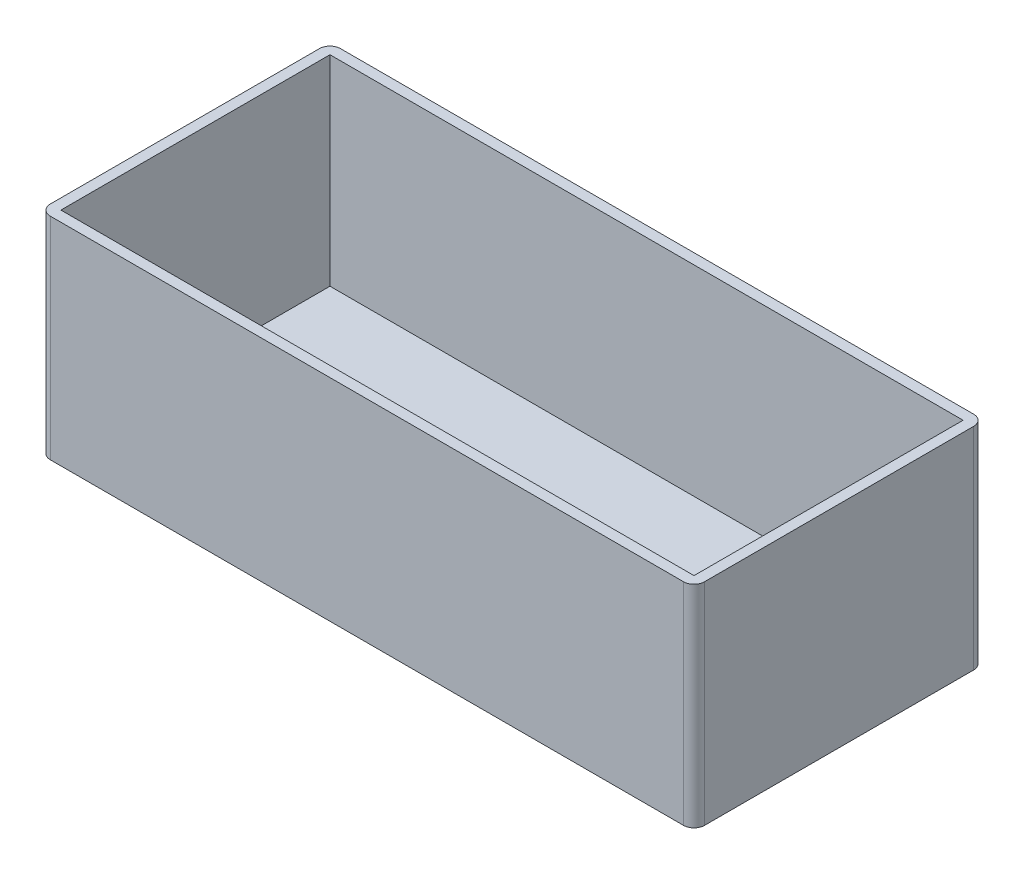
ISO-10303-21;
HEADER;
FILE_DESCRIPTION(('STEP AP214'),'2;1');
FILE_NAME('part.step','',(''),(''),'','','');
FILE_SCHEMA(('AUTOMOTIVE_DESIGN { 1 0 10303 214 1 1 1 1 }'));
ENDSEC;
DATA;
#1=APPLICATION_CONTEXT('core data for automotive mechanical design processes');
#2=APPLICATION_PROTOCOL_DEFINITION('international standard','automotive_design',2000,#1);
#3=PRODUCT_CONTEXT('',#1,'mechanical');
#4=PRODUCT('Part','Part','',(#3));
#5=PRODUCT_RELATED_PRODUCT_CATEGORY('part','',(#4));
#6=PRODUCT_DEFINITION_FORMATION('','',#4);
#7=PRODUCT_DEFINITION_CONTEXT('part definition',#1,'design');
#8=PRODUCT_DEFINITION('design','',#6,#7);
#9=PRODUCT_DEFINITION_SHAPE('','',#8);
#10=(LENGTH_UNIT() NAMED_UNIT(*) SI_UNIT(.MILLI.,.METRE.));
#11=(NAMED_UNIT(*) PLANE_ANGLE_UNIT() SI_UNIT($,.RADIAN.));
#12=(NAMED_UNIT(*) SI_UNIT($,.STERADIAN.) SOLID_ANGLE_UNIT());
#13=UNCERTAINTY_MEASURE_WITH_UNIT(LENGTH_MEASURE(1.E-05),#10,'distance_accuracy_value','');
#14=(GEOMETRIC_REPRESENTATION_CONTEXT(3) GLOBAL_UNCERTAINTY_ASSIGNED_CONTEXT((#13)) GLOBAL_UNIT_ASSIGNED_CONTEXT((#10,
#11,#12)) REPRESENTATION_CONTEXT('',''));
#15=CARTESIAN_POINT('',(0.,0.,0.));
#16=DIRECTION('',(0.,0.,1.));
#17=DIRECTION('',(1.,0.,0.));
#18=AXIS2_PLACEMENT_3D('',#15,#16,#17);
#19=CARTESIAN_POINT('',(2.,40.,-53.));
#20=DIRECTION('',(0.,1.,0.));
#21=DIRECTION('',(0.,0.,1.));
#22=AXIS2_PLACEMENT_3D('',#19,#20,#21);
#23=PLANE('',#22);
#24=CARTESIAN_POINT('',(2.,40.,-53.));
#25=DIRECTION('',(0.,1.,0.));
#26=DIRECTION('',(0.,0.,1.));
#27=AXIS2_PLACEMENT_3D('',#24,#25,#26);
#28=CIRCLE('',#27,2.);
#29=CARTESIAN_POINT('',(2.00000000000001,40.,-55.));
#30=VERTEX_POINT('',#29);
#31=CARTESIAN_POINT('',(0.,40.,-53.));
#32=VERTEX_POINT('',#31);
#33=EDGE_CURVE('E94',#30,#32,#28,.T.);
#34=ORIENTED_EDGE('',*,*,#33,.T.);
#35=DIRECTION('',(0.,0.,-1.));
#36=VECTOR('',#35,1.);
#37=CARTESIAN_POINT('',(0.,40.,-2.00000000000001));
#38=LINE('',#37,#36);
#39=CARTESIAN_POINT('',(0.,40.,-2.00000000000001));
#40=VERTEX_POINT('',#39);
#41=EDGE_CURVE('E180',#40,#32,#38,.T.);
#42=ORIENTED_EDGE('',*,*,#41,.F.);
#43=CARTESIAN_POINT('',(2.,40.,-2.));
#44=DIRECTION('',(0.,1.,0.));
#45=DIRECTION('',(0.,0.,1.));
#46=AXIS2_PLACEMENT_3D('',#43,#44,#45);
#47=CIRCLE('',#46,2.);
#48=CARTESIAN_POINT('',(2.00000000000001,40.,0.));
#49=VERTEX_POINT('',#48);
#50=EDGE_CURVE('E171',#40,#49,#47,.T.);
#51=ORIENTED_EDGE('',*,*,#50,.T.);
#52=DIRECTION('',(1.,0.,0.));
#53=VECTOR('',#52,1.);
#54=CARTESIAN_POINT('',(2.00000000000001,40.,0.));
#55=LINE('',#54,#53);
#56=CARTESIAN_POINT('',(122.,40.,0.));
#57=VERTEX_POINT('',#56);
#58=EDGE_CURVE('E188',#49,#57,#55,.T.);
#59=ORIENTED_EDGE('',*,*,#58,.T.);
#60=CARTESIAN_POINT('',(122.,40.,-2.));
#61=DIRECTION('',(0.,1.,0.));
#62=DIRECTION('',(0.,0.,1.));
#63=AXIS2_PLACEMENT_3D('',#60,#61,#62);
#64=CIRCLE('',#63,2.);
#65=CARTESIAN_POINT('',(124.,40.,-2.00000000000001));
#66=VERTEX_POINT('',#65);
#67=EDGE_CURVE('E118',#57,#66,#64,.T.);
#68=ORIENTED_EDGE('',*,*,#67,.T.);
#69=DIRECTION('',(0.,0.,-1.));
#70=VECTOR('',#69,1.);
#71=CARTESIAN_POINT('',(124.,40.,-2.00000000000001));
#72=LINE('',#71,#70);
#73=CARTESIAN_POINT('',(124.,40.,-53.));
#74=VERTEX_POINT('',#73);
#75=EDGE_CURVE('E112',#66,#74,#72,.T.);
#76=ORIENTED_EDGE('',*,*,#75,.T.);
#77=CARTESIAN_POINT('',(122.,40.,-53.));
#78=DIRECTION('',(0.,-1.,0.));
#79=DIRECTION('',(0.,0.,-1.));
#80=AXIS2_PLACEMENT_3D('',#77,#78,#79);
#81=CIRCLE('',#80,2.);
#82=CARTESIAN_POINT('',(122.,40.,-55.));
#83=VERTEX_POINT('',#82);
#84=EDGE_CURVE('E116',#83,#74,#81,.T.);
#85=ORIENTED_EDGE('',*,*,#84,.F.);
#86=DIRECTION('',(1.,0.,0.));
#87=VECTOR('',#86,1.);
#88=CARTESIAN_POINT('',(2.00000000000001,40.,-55.));
#89=LINE('',#88,#87);
#90=EDGE_CURVE('E135',#30,#83,#89,.T.);
#91=ORIENTED_EDGE('',*,*,#90,.F.);
#92=EDGE_LOOP('',(#34,#42,#51,#59,#68,#76,#85,#91));
#93=FACE_BOUND('',#92,.T.);
#94=DIRECTION('',(0.,0.,-1.));
#95=VECTOR('',#94,1.);
#96=CARTESIAN_POINT('',(2.,40.,-2.00000000000001));
#97=LINE('',#96,#95);
#98=CARTESIAN_POINT('',(2.,40.,-2.));
#99=VERTEX_POINT('',#98);
#100=CARTESIAN_POINT('',(2.,40.,-53.));
#101=VERTEX_POINT('',#100);
#102=EDGE_CURVE('E202',#99,#101,#97,.T.);
#103=ORIENTED_EDGE('',*,*,#102,.T.);
#104=DIRECTION('',(1.,0.,0.));
#105=VECTOR('',#104,1.);
#106=CARTESIAN_POINT('',(2.00000000000001,40.,-53.));
#107=LINE('',#106,#105);
#108=CARTESIAN_POINT('',(122.,40.,-53.));
#109=VERTEX_POINT('',#108);
#110=EDGE_CURVE('E194',#101,#109,#107,.T.);
#111=ORIENTED_EDGE('',*,*,#110,.T.);
#112=DIRECTION('',(0.,0.,-1.));
#113=VECTOR('',#112,1.);
#114=CARTESIAN_POINT('',(122.,40.,-2.00000000000001));
#115=LINE('',#114,#113);
#116=CARTESIAN_POINT('',(122.,40.,-2.));
#117=VERTEX_POINT('',#116);
#118=EDGE_CURVE('E198',#117,#109,#115,.T.);
#119=ORIENTED_EDGE('',*,*,#118,.F.);
#120=DIRECTION('',(1.,0.,0.));
#121=VECTOR('',#120,1.);
#122=CARTESIAN_POINT('',(2.00000000000001,40.,-2.));
#123=LINE('',#122,#121);
#124=EDGE_CURVE('E200',#99,#117,#123,.T.);
#125=ORIENTED_EDGE('',*,*,#124,.F.);
#126=EDGE_LOOP('',(#103,#111,#119,#125));
#127=FACE_BOUND('',#126,.T.);
#128=ADVANCED_FACE('F32',(#93,#127),#23,.T.);
#129=CARTESIAN_POINT('',(2.,40.,-53.));
#130=DIRECTION('',(0.,-1.,0.));
#131=DIRECTION('',(0.,0.,-1.));
#132=AXIS2_PLACEMENT_3D('',#129,#130,#131);
#133=CYLINDRICAL_SURFACE('',#132,2.);
#134=CARTESIAN_POINT('',(2.,0.,-53.));
#135=DIRECTION('',(0.,1.,0.));
#136=DIRECTION('',(0.,0.,1.));
#137=AXIS2_PLACEMENT_3D('',#134,#135,#136);
#138=CIRCLE('',#137,2.);
#139=CARTESIAN_POINT('',(2.00000000000001,0.,-55.));
#140=VERTEX_POINT('',#139);
#141=CARTESIAN_POINT('',(0.,0.,-53.));
#142=VERTEX_POINT('',#141);
#143=EDGE_CURVE('E140',#140,#142,#138,.T.);
#144=ORIENTED_EDGE('',*,*,#143,.T.);
#145=DIRECTION('',(0.,-1.,0.));
#146=VECTOR('',#145,1.);
#147=CARTESIAN_POINT('',(0.,40.,-53.));
#148=LINE('',#147,#146);
#149=EDGE_CURVE('E11',#32,#142,#148,.T.);
#150=ORIENTED_EDGE('',*,*,#149,.F.);
#151=ORIENTED_EDGE('',*,*,#33,.F.);
#152=DIRECTION('',(0.,-1.,0.));
#153=VECTOR('',#152,1.);
#154=CARTESIAN_POINT('',(2.00000000000001,40.,-55.));
#155=LINE('',#154,#153);
#156=EDGE_CURVE('E56',#30,#140,#155,.T.);
#157=ORIENTED_EDGE('',*,*,#156,.T.);
#158=EDGE_LOOP('',(#144,#150,#151,#157));
#159=FACE_BOUND('',#158,.T.);
#160=ADVANCED_FACE('F34',(#159),#133,.T.);
#161=CARTESIAN_POINT('',(0.,40.,-2.00000000000001));
#162=DIRECTION('',(-1.,0.,0.));
#163=DIRECTION('',(0.,0.,1.));
#164=AXIS2_PLACEMENT_3D('',#161,#162,#163);
#165=PLANE('',#164);
#166=DIRECTION('',(0.,0.,-1.));
#167=VECTOR('',#166,1.);
#168=CARTESIAN_POINT('',(0.,0.,-2.00000000000001));
#169=LINE('',#168,#167);
#170=CARTESIAN_POINT('',(0.,0.,-2.00000000000001));
#171=VERTEX_POINT('',#170);
#172=EDGE_CURVE('E142',#171,#142,#169,.T.);
#173=ORIENTED_EDGE('',*,*,#172,.F.);
#174=DIRECTION('',(0.,-1.,0.));
#175=VECTOR('',#174,1.);
#176=CARTESIAN_POINT('',(0.,40.,-2.00000000000001));
#177=LINE('',#176,#175);
#178=EDGE_CURVE('E40',#40,#171,#177,.T.);
#179=ORIENTED_EDGE('',*,*,#178,.F.);
#180=ORIENTED_EDGE('',*,*,#41,.T.);
#181=ORIENTED_EDGE('',*,*,#149,.T.);
#182=EDGE_LOOP('',(#173,#179,#180,#181));
#183=FACE_BOUND('',#182,.T.);
#184=ADVANCED_FACE('F179',(#183),#165,.T.);
#185=CARTESIAN_POINT('',(2.,40.,-2.));
#186=DIRECTION('',(0.,-1.,0.));
#187=DIRECTION('',(0.,0.,-1.));
#188=AXIS2_PLACEMENT_3D('',#185,#186,#187);
#189=CYLINDRICAL_SURFACE('',#188,2.);
#190=CARTESIAN_POINT('',(2.,0.,-2.));
#191=DIRECTION('',(0.,1.,0.));
#192=DIRECTION('',(0.,0.,1.));
#193=AXIS2_PLACEMENT_3D('',#190,#191,#192);
#194=CIRCLE('',#193,2.);
#195=CARTESIAN_POINT('',(2.00000000000001,0.,0.));
#196=VERTEX_POINT('',#195);
#197=EDGE_CURVE('E146',#171,#196,#194,.T.);
#198=ORIENTED_EDGE('',*,*,#197,.T.);
#199=DIRECTION('',(0.,-1.,0.));
#200=VECTOR('',#199,1.);
#201=CARTESIAN_POINT('',(2.00000000000001,40.,0.));
#202=LINE('',#201,#200);
#203=EDGE_CURVE('E164',#49,#196,#202,.T.);
#204=ORIENTED_EDGE('',*,*,#203,.F.);
#205=ORIENTED_EDGE('',*,*,#50,.F.);
#206=ORIENTED_EDGE('',*,*,#178,.T.);
#207=EDGE_LOOP('',(#198,#204,#205,#206));
#208=FACE_BOUND('',#207,.T.);
#209=ADVANCED_FACE('F169',(#208),#189,.T.);
#210=CARTESIAN_POINT('',(2.00000000000001,40.,0.));
#211=DIRECTION('',(0.,0.,-1.));
#212=DIRECTION('',(-1.,0.,0.));
#213=AXIS2_PLACEMENT_3D('',#210,#211,#212);
#214=PLANE('',#213);
#215=DIRECTION('',(1.,0.,0.));
#216=VECTOR('',#215,1.);
#217=CARTESIAN_POINT('',(2.00000000000001,0.,0.));
#218=LINE('',#217,#216);
#219=CARTESIAN_POINT('',(122.,0.,0.));
#220=VERTEX_POINT('',#219);
#221=EDGE_CURVE('E148',#196,#220,#218,.T.);
#222=ORIENTED_EDGE('',*,*,#221,.T.);
#223=DIRECTION('',(0.,-1.,0.));
#224=VECTOR('',#223,1.);
#225=CARTESIAN_POINT('',(122.,40.,0.));
#226=LINE('',#225,#224);
#227=EDGE_CURVE('E161',#57,#220,#226,.T.);
#228=ORIENTED_EDGE('',*,*,#227,.F.);
#229=ORIENTED_EDGE('',*,*,#58,.F.);
#230=ORIENTED_EDGE('',*,*,#203,.T.);
#231=EDGE_LOOP('',(#222,#228,#229,#230));
#232=FACE_BOUND('',#231,.T.);
#233=ADVANCED_FACE('F187',(#232),#214,.F.);
#234=CARTESIAN_POINT('',(122.,40.,-2.));
#235=DIRECTION('',(0.,-1.,0.));
#236=DIRECTION('',(0.,0.,-1.));
#237=AXIS2_PLACEMENT_3D('',#234,#235,#236);
#238=CYLINDRICAL_SURFACE('',#237,2.);
#239=CARTESIAN_POINT('',(122.,0.,-2.));
#240=DIRECTION('',(0.,1.,0.));
#241=DIRECTION('',(0.,0.,1.));
#242=AXIS2_PLACEMENT_3D('',#239,#240,#241);
#243=CIRCLE('',#242,2.);
#244=CARTESIAN_POINT('',(124.,0.,-2.00000000000001));
#245=VERTEX_POINT('',#244);
#246=EDGE_CURVE('E150',#220,#245,#243,.T.);
#247=ORIENTED_EDGE('',*,*,#246,.T.);
#248=DIRECTION('',(0.,-1.,0.));
#249=VECTOR('',#248,1.);
#250=CARTESIAN_POINT('',(124.,40.,-2.00000000000001));
#251=LINE('',#250,#249);
#252=EDGE_CURVE('E131',#66,#245,#251,.T.);
#253=ORIENTED_EDGE('',*,*,#252,.F.);
#254=ORIENTED_EDGE('',*,*,#67,.F.);
#255=ORIENTED_EDGE('',*,*,#227,.T.);
#256=EDGE_LOOP('',(#247,#253,#254,#255));
#257=FACE_BOUND('',#256,.T.);
#258=ADVANCED_FACE('F183',(#257),#238,.T.);
#259=CARTESIAN_POINT('',(124.,40.,-2.00000000000001));
#260=DIRECTION('',(-1.,0.,0.));
#261=DIRECTION('',(0.,0.,1.));
#262=AXIS2_PLACEMENT_3D('',#259,#260,#261);
#263=PLANE('',#262);
#264=DIRECTION('',(0.,0.,-1.));
#265=VECTOR('',#264,1.);
#266=CARTESIAN_POINT('',(124.,0.,-2.00000000000001));
#267=LINE('',#266,#265);
#268=CARTESIAN_POINT('',(124.,0.,-53.));
#269=VERTEX_POINT('',#268);
#270=EDGE_CURVE('E127',#245,#269,#267,.T.);
#271=ORIENTED_EDGE('',*,*,#270,.T.);
#272=DIRECTION('',(0.,-1.,0.));
#273=VECTOR('',#272,1.);
#274=CARTESIAN_POINT('',(124.,40.,-53.));
#275=LINE('',#274,#273);
#276=EDGE_CURVE('E124',#74,#269,#275,.T.);
#277=ORIENTED_EDGE('',*,*,#276,.F.);
#278=ORIENTED_EDGE('',*,*,#75,.F.);
#279=ORIENTED_EDGE('',*,*,#252,.T.);
#280=EDGE_LOOP('',(#271,#277,#278,#279));
#281=FACE_BOUND('',#280,.T.);
#282=ADVANCED_FACE('F125',(#281),#263,.F.);
#283=CARTESIAN_POINT('',(122.,40.,-53.));
#284=DIRECTION('',(0.,-1.,0.));
#285=DIRECTION('',(0.,0.,-1.));
#286=AXIS2_PLACEMENT_3D('',#283,#284,#285);
#287=CYLINDRICAL_SURFACE('',#286,2.);
#288=CARTESIAN_POINT('',(122.,0.,-53.));
#289=DIRECTION('',(0.,-1.,0.));
#290=DIRECTION('',(0.,0.,-1.));
#291=AXIS2_PLACEMENT_3D('',#288,#289,#290);
#292=CIRCLE('',#291,2.);
#293=CARTESIAN_POINT('',(122.,0.,-55.));
#294=VERTEX_POINT('',#293);
#295=EDGE_CURVE('E153',#294,#269,#292,.T.);
#296=ORIENTED_EDGE('',*,*,#295,.F.);
#297=DIRECTION('',(0.,-1.,0.));
#298=VECTOR('',#297,1.);
#299=CARTESIAN_POINT('',(122.,40.,-55.));
#300=LINE('',#299,#298);
#301=EDGE_CURVE('E132',#83,#294,#300,.T.);
#302=ORIENTED_EDGE('',*,*,#301,.F.);
#303=ORIENTED_EDGE('',*,*,#84,.T.);
#304=ORIENTED_EDGE('',*,*,#276,.T.);
#305=EDGE_LOOP('',(#296,#302,#303,#304));
#306=FACE_BOUND('',#305,.T.);
#307=ADVANCED_FACE('F134',(#306),#287,.T.);
#308=CARTESIAN_POINT('',(2.00000000000001,40.,-55.));
#309=DIRECTION('',(0.,0.,-1.));
#310=DIRECTION('',(-1.,0.,0.));
#311=AXIS2_PLACEMENT_3D('',#308,#309,#310);
#312=PLANE('',#311);
#313=DIRECTION('',(1.,0.,0.));
#314=VECTOR('',#313,1.);
#315=CARTESIAN_POINT('',(2.00000000000001,0.,-55.));
#316=LINE('',#315,#314);
#317=EDGE_CURVE('E155',#140,#294,#316,.T.);
#318=ORIENTED_EDGE('',*,*,#317,.F.);
#319=ORIENTED_EDGE('',*,*,#156,.F.);
#320=ORIENTED_EDGE('',*,*,#90,.T.);
#321=ORIENTED_EDGE('',*,*,#301,.T.);
#322=EDGE_LOOP('',(#318,#319,#320,#321));
#323=FACE_BOUND('',#322,.T.);
#324=ADVANCED_FACE('F181',(#323),#312,.T.);
#325=CARTESIAN_POINT('',(2.,0.,-53.));
#326=DIRECTION('',(0.,1.,0.));
#327=DIRECTION('',(0.,0.,1.));
#328=AXIS2_PLACEMENT_3D('',#325,#326,#327);
#329=PLANE('',#328);
#330=ORIENTED_EDGE('',*,*,#143,.F.);
#331=ORIENTED_EDGE('',*,*,#317,.T.);
#332=ORIENTED_EDGE('',*,*,#295,.T.);
#333=ORIENTED_EDGE('',*,*,#270,.F.);
#334=ORIENTED_EDGE('',*,*,#246,.F.);
#335=ORIENTED_EDGE('',*,*,#221,.F.);
#336=ORIENTED_EDGE('',*,*,#197,.F.);
#337=ORIENTED_EDGE('',*,*,#172,.T.);
#338=EDGE_LOOP('',(#330,#331,#332,#333,#334,#335,#336,#337));
#339=FACE_BOUND('',#338,.T.);
#340=ADVANCED_FACE('F177',(#339),#329,.F.);
#341=CARTESIAN_POINT('',(2.,40.,-2.00000000000001));
#342=DIRECTION('',(-1.,0.,0.));
#343=DIRECTION('',(0.,0.,1.));
#344=AXIS2_PLACEMENT_3D('',#341,#342,#343);
#345=PLANE('',#344);
#346=DIRECTION('',(0.,0.,-1.));
#347=VECTOR('',#346,1.);
#348=CARTESIAN_POINT('',(2.,2.,-2.00000000000001));
#349=LINE('',#348,#347);
#350=CARTESIAN_POINT('',(2.,2.,-2.));
#351=VERTEX_POINT('',#350);
#352=CARTESIAN_POINT('',(2.,2.,-53.));
#353=VERTEX_POINT('',#352);
#354=EDGE_CURVE('E218',#351,#353,#349,.T.);
#355=ORIENTED_EDGE('',*,*,#354,.T.);
#356=DIRECTION('',(0.,-1.,0.));
#357=VECTOR('',#356,1.);
#358=CARTESIAN_POINT('',(2.,40.,-53.));
#359=LINE('',#358,#357);
#360=EDGE_CURVE('E143',#101,#353,#359,.T.);
#361=ORIENTED_EDGE('',*,*,#360,.F.);
#362=ORIENTED_EDGE('',*,*,#102,.F.);
#363=DIRECTION('',(0.,-1.,0.));
#364=VECTOR('',#363,1.);
#365=CARTESIAN_POINT('',(2.,40.,-2.));
#366=LINE('',#365,#364);
#367=EDGE_CURVE('E215',#99,#351,#366,.T.);
#368=ORIENTED_EDGE('',*,*,#367,.T.);
#369=EDGE_LOOP('',(#355,#361,#362,#368));
#370=FACE_BOUND('',#369,.T.);
#371=ADVANCED_FACE('F228',(#370),#345,.F.);
#372=CARTESIAN_POINT('',(2.00000000000001,40.,-2.));
#373=DIRECTION('',(0.,0.,-1.));
#374=DIRECTION('',(-1.,0.,0.));
#375=AXIS2_PLACEMENT_3D('',#372,#373,#374);
#376=PLANE('',#375);
#377=DIRECTION('',(1.,0.,0.));
#378=VECTOR('',#377,1.);
#379=CARTESIAN_POINT('',(2.00000000000001,2.,-2.));
#380=LINE('',#379,#378);
#381=CARTESIAN_POINT('',(122.,2.,-2.));
#382=VERTEX_POINT('',#381);
#383=EDGE_CURVE('E213',#351,#382,#380,.T.);
#384=ORIENTED_EDGE('',*,*,#383,.F.);
#385=ORIENTED_EDGE('',*,*,#367,.F.);
#386=ORIENTED_EDGE('',*,*,#124,.T.);
#387=DIRECTION('',(0.,-1.,0.));
#388=VECTOR('',#387,1.);
#389=CARTESIAN_POINT('',(122.,40.,-2.));
#390=LINE('',#389,#388);
#391=EDGE_CURVE('E47',#117,#382,#390,.T.);
#392=ORIENTED_EDGE('',*,*,#391,.T.);
#393=EDGE_LOOP('',(#384,#385,#386,#392));
#394=FACE_BOUND('',#393,.T.);
#395=ADVANCED_FACE('F252',(#394),#376,.T.);
#396=CARTESIAN_POINT('',(122.,40.,-2.00000000000001));
#397=DIRECTION('',(-1.,0.,0.));
#398=DIRECTION('',(0.,0.,1.));
#399=AXIS2_PLACEMENT_3D('',#396,#397,#398);
#400=PLANE('',#399);
#401=DIRECTION('',(0.,0.,-1.));
#402=VECTOR('',#401,1.);
#403=CARTESIAN_POINT('',(122.,2.,-2.00000000000001));
#404=LINE('',#403,#402);
#405=CARTESIAN_POINT('',(122.,2.,-53.));
#406=VERTEX_POINT('',#405);
#407=EDGE_CURVE('E208',#382,#406,#404,.T.);
#408=ORIENTED_EDGE('',*,*,#407,.F.);
#409=ORIENTED_EDGE('',*,*,#391,.F.);
#410=ORIENTED_EDGE('',*,*,#118,.T.);
#411=DIRECTION('',(0.,-1.,0.));
#412=VECTOR('',#411,1.);
#413=CARTESIAN_POINT('',(122.,40.,-53.));
#414=LINE('',#413,#412);
#415=EDGE_CURVE('E197',#109,#406,#414,.T.);
#416=ORIENTED_EDGE('',*,*,#415,.T.);
#417=EDGE_LOOP('',(#408,#409,#410,#416));
#418=FACE_BOUND('',#417,.T.);
#419=ADVANCED_FACE('F245',(#418),#400,.T.);
#420=CARTESIAN_POINT('',(2.00000000000001,40.,-53.));
#421=DIRECTION('',(0.,0.,-1.));
#422=DIRECTION('',(-1.,0.,0.));
#423=AXIS2_PLACEMENT_3D('',#420,#421,#422);
#424=PLANE('',#423);
#425=DIRECTION('',(1.,0.,0.));
#426=VECTOR('',#425,1.);
#427=CARTESIAN_POINT('',(2.00000000000001,2.,-53.));
#428=LINE('',#427,#426);
#429=EDGE_CURVE('E205',#353,#406,#428,.T.);
#430=ORIENTED_EDGE('',*,*,#429,.T.);
#431=ORIENTED_EDGE('',*,*,#415,.F.);
#432=ORIENTED_EDGE('',*,*,#110,.F.);
#433=ORIENTED_EDGE('',*,*,#360,.T.);
#434=EDGE_LOOP('',(#430,#431,#432,#433));
#435=FACE_BOUND('',#434,.T.);
#436=ADVANCED_FACE('F239',(#435),#424,.F.);
#437=CARTESIAN_POINT('',(2.,2.,-53.));
#438=DIRECTION('',(0.,1.,0.));
#439=DIRECTION('',(0.,0.,1.));
#440=AXIS2_PLACEMENT_3D('',#437,#438,#439);
#441=PLANE('',#440);
#442=ORIENTED_EDGE('',*,*,#354,.F.);
#443=ORIENTED_EDGE('',*,*,#383,.T.);
#444=ORIENTED_EDGE('',*,*,#407,.T.);
#445=ORIENTED_EDGE('',*,*,#429,.F.);
#446=EDGE_LOOP('',(#442,#443,#444,#445));
#447=FACE_BOUND('',#446,.T.);
#448=ADVANCED_FACE('F241',(#447),#441,.T.);
#449=CLOSED_SHELL('',(#128,#160,#184,#209,#233,#258,#282,#307,#324,#340,#371,#395,#419,#436,#448));
#450=MANIFOLD_SOLID_BREP('B2',#449);
#451=ADVANCED_BREP_SHAPE_REPRESENTATION('',(#18,#450),#14);
#452=SHAPE_DEFINITION_REPRESENTATION(#9,#451);
ENDSEC;
END-ISO-10303-21;
